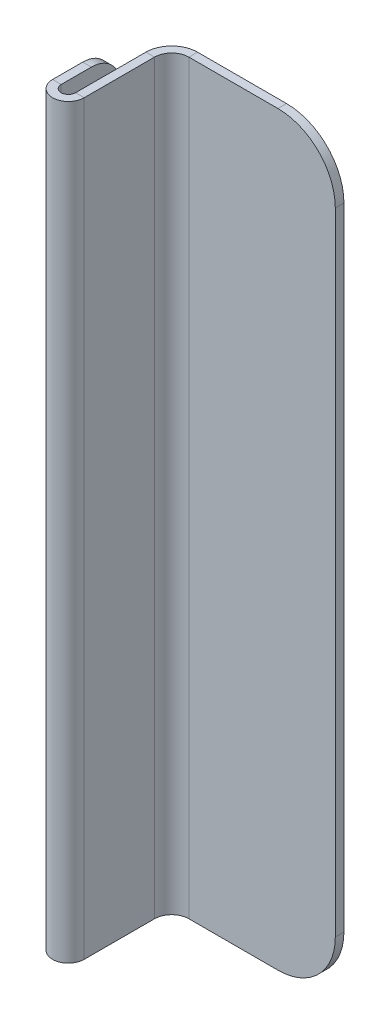
ISO-10303-21;
HEADER;
FILE_DESCRIPTION(('STEP AP214'),'2;1');
FILE_NAME('part.step','',(''),(''),'','','');
FILE_SCHEMA(('AUTOMOTIVE_DESIGN { 1 0 10303 214 1 1 1 1 }'));
ENDSEC;
DATA;
#1=APPLICATION_CONTEXT('core data for automotive mechanical design processes');
#2=APPLICATION_PROTOCOL_DEFINITION('international standard','automotive_design',2000,#1);
#3=PRODUCT_CONTEXT('',#1,'mechanical');
#4=PRODUCT('Part','Part','',(#3));
#5=PRODUCT_RELATED_PRODUCT_CATEGORY('part','',(#4));
#6=PRODUCT_DEFINITION_FORMATION('','',#4);
#7=PRODUCT_DEFINITION_CONTEXT('part definition',#1,'design');
#8=PRODUCT_DEFINITION('design','',#6,#7);
#9=PRODUCT_DEFINITION_SHAPE('','',#8);
#10=(LENGTH_UNIT() NAMED_UNIT(*) SI_UNIT(.MILLI.,.METRE.));
#11=(NAMED_UNIT(*) PLANE_ANGLE_UNIT() SI_UNIT($,.RADIAN.));
#12=(NAMED_UNIT(*) SI_UNIT($,.STERADIAN.) SOLID_ANGLE_UNIT());
#13=UNCERTAINTY_MEASURE_WITH_UNIT(LENGTH_MEASURE(1.E-05),#10,'distance_accuracy_value','');
#14=(GEOMETRIC_REPRESENTATION_CONTEXT(3) GLOBAL_UNCERTAINTY_ASSIGNED_CONTEXT((#13)) GLOBAL_UNIT_ASSIGNED_CONTEXT((#10,
#11,#12)) REPRESENTATION_CONTEXT('',''));
#15=CARTESIAN_POINT('',(0.,0.,0.));
#16=DIRECTION('',(0.,0.,1.));
#17=DIRECTION('',(1.,0.,0.));
#18=AXIS2_PLACEMENT_3D('',#15,#16,#17);
#19=CARTESIAN_POINT('',(-47.7819300058113,-53.0514705882353,-1.5));
#20=DIRECTION('',(0.,-1.,0.));
#21=DIRECTION('',(0.,0.,-1.));
#22=AXIS2_PLACEMENT_3D('',#19,#20,#21);
#23=PLANE('',#22);
#24=DIRECTION('',(1.,0.,0.));
#25=VECTOR('',#24,1.);
#26=CARTESIAN_POINT('',(-47.7819300058113,-53.0514705882353,0.));
#27=LINE('',#26,#25);
#28=CARTESIAN_POINT('',(-43.2819300058113,-53.0514705882353,0.));
#29=VERTEX_POINT('',#28);
#30=CARTESIAN_POINT('',(-27.7819300058113,-53.0514705882353,0.));
#31=VERTEX_POINT('',#30);
#32=EDGE_CURVE('E263',#29,#31,#27,.T.);
#33=ORIENTED_EDGE('',*,*,#32,.F.);
#34=DIRECTION('',(0.,0.,-1.));
#35=VECTOR('',#34,1.);
#36=CARTESIAN_POINT('',(-43.2819300058113,-53.0514705882353,0.));
#37=LINE('',#36,#35);
#38=CARTESIAN_POINT('',(-43.2819300058113,-53.0514705882353,-1.5));
#39=VERTEX_POINT('',#38);
#40=EDGE_CURVE('E247',#29,#39,#37,.T.);
#41=ORIENTED_EDGE('',*,*,#40,.T.);
#42=DIRECTION('',(1.,0.,0.));
#43=VECTOR('',#42,1.);
#44=CARTESIAN_POINT('',(-47.7819300058113,-53.0514705882353,-1.5));
#45=LINE('',#44,#43);
#46=CARTESIAN_POINT('',(-27.7819300058113,-53.0514705882353,-1.5));
#47=VERTEX_POINT('',#46);
#48=EDGE_CURVE('E266',#39,#47,#45,.T.);
#49=ORIENTED_EDGE('',*,*,#48,.T.);
#50=DIRECTION('',(0.,0.,1.));
#51=VECTOR('',#50,1.);
#52=CARTESIAN_POINT('',(-27.7819300058113,-53.0514705882353,-1.5));
#53=LINE('',#52,#51);
#54=EDGE_CURVE('E297',#47,#31,#53,.T.);
#55=ORIENTED_EDGE('',*,*,#54,.T.);
#56=EDGE_LOOP('',(#33,#41,#49,#55));
#57=FACE_BOUND('',#56,.T.);
#58=ADVANCED_FACE('F71',(#57),#23,.T.);
#59=CARTESIAN_POINT('',(0.,0.,-1.5));
#60=DIRECTION('',(0.,0.,1.));
#61=DIRECTION('',(1.,0.,0.));
#62=AXIS2_PLACEMENT_3D('',#59,#60,#61);
#63=PLANE('',#62);
#64=DIRECTION('',(0.,-1.,0.));
#65=VECTOR('',#64,1.);
#66=CARTESIAN_POINT('',(-43.2819300058113,-53.0514705882353,-1.5));
#67=LINE('',#66,#65);
#68=CARTESIAN_POINT('',(-43.2819300058113,76.9485294117647,-1.5));
#69=VERTEX_POINT('',#68);
#70=EDGE_CURVE('E241',#39,#69,#67,.F.);
#71=ORIENTED_EDGE('',*,*,#70,.T.);
#72=DIRECTION('',(-1.,0.,0.));
#73=VECTOR('',#72,1.);
#74=CARTESIAN_POINT('',(-47.7819300058113,76.9485294117647,-1.5));
#75=LINE('',#74,#73);
#76=CARTESIAN_POINT('',(-27.7819300058113,76.9485294117647,-1.5));
#77=VERTEX_POINT('',#76);
#78=EDGE_CURVE('E272',#77,#69,#75,.T.);
#79=ORIENTED_EDGE('',*,*,#78,.F.);
#80=CARTESIAN_POINT('',(-27.7819300058113,66.9485294117647,-1.5));
#81=DIRECTION('',(0.,0.,1.));
#82=DIRECTION('',(1.,0.,0.));
#83=AXIS2_PLACEMENT_3D('',#80,#81,#82);
#84=CIRCLE('',#83,10.);
#85=CARTESIAN_POINT('',(-17.7819300058113,66.9485294117647,-1.5));
#86=VERTEX_POINT('',#85);
#87=EDGE_CURVE('E295',#77,#86,#84,.F.);
#88=ORIENTED_EDGE('',*,*,#87,.T.);
#89=DIRECTION('',(0.,1.,0.));
#90=VECTOR('',#89,1.);
#91=CARTESIAN_POINT('',(-17.7819300058113,76.9485294117647,-1.5));
#92=LINE('',#91,#90);
#93=CARTESIAN_POINT('',(-17.7819300058113,-43.0514705882353,-1.5));
#94=VERTEX_POINT('',#93);
#95=EDGE_CURVE('E268',#94,#86,#92,.T.);
#96=ORIENTED_EDGE('',*,*,#95,.F.);
#97=CARTESIAN_POINT('',(-27.7819300058113,-43.0514705882353,-1.5));
#98=DIRECTION('',(0.,0.,1.));
#99=DIRECTION('',(1.,0.,0.));
#100=AXIS2_PLACEMENT_3D('',#97,#98,#99);
#101=CIRCLE('',#100,10.);
#102=EDGE_CURVE('E292',#94,#47,#101,.F.);
#103=ORIENTED_EDGE('',*,*,#102,.T.);
#104=ORIENTED_EDGE('',*,*,#48,.F.);
#105=EDGE_LOOP('',(#71,#79,#88,#96,#103,#104));
#106=FACE_BOUND('',#105,.T.);
#107=ADVANCED_FACE('F384',(#106),#63,.F.);
#108=CARTESIAN_POINT('',(0.,0.,0.));
#109=DIRECTION('',(0.,0.,1.));
#110=DIRECTION('',(1.,0.,0.));
#111=AXIS2_PLACEMENT_3D('',#108,#109,#110);
#112=PLANE('',#111);
#113=DIRECTION('',(-1.,0.,0.));
#114=VECTOR('',#113,1.);
#115=CARTESIAN_POINT('',(-47.7819300058113,76.9485294117647,0.));
#116=LINE('',#115,#114);
#117=CARTESIAN_POINT('',(-27.7819300058113,76.9485294117647,0.));
#118=VERTEX_POINT('',#117);
#119=CARTESIAN_POINT('',(-43.2819300058113,76.9485294117647,0.));
#120=VERTEX_POINT('',#119);
#121=EDGE_CURVE('E269',#118,#120,#116,.T.);
#122=ORIENTED_EDGE('',*,*,#121,.T.);
#123=DIRECTION('',(0.,-1.,0.));
#124=VECTOR('',#123,1.);
#125=CARTESIAN_POINT('',(-43.2819300058113,-53.0514705882353,0.));
#126=LINE('',#125,#124);
#127=EDGE_CURVE('E253',#29,#120,#126,.F.);
#128=ORIENTED_EDGE('',*,*,#127,.F.);
#129=ORIENTED_EDGE('',*,*,#32,.T.);
#130=CARTESIAN_POINT('',(-27.7819300058113,-43.0514705882353,0.));
#131=DIRECTION('',(0.,0.,1.));
#132=DIRECTION('',(1.,0.,0.));
#133=AXIS2_PLACEMENT_3D('',#130,#131,#132);
#134=CIRCLE('',#133,10.);
#135=CARTESIAN_POINT('',(-17.7819300058113,-43.0514705882353,0.));
#136=VERTEX_POINT('',#135);
#137=EDGE_CURVE('E286',#31,#136,#134,.T.);
#138=ORIENTED_EDGE('',*,*,#137,.T.);
#139=DIRECTION('',(0.,1.,0.));
#140=VECTOR('',#139,1.);
#141=CARTESIAN_POINT('',(-17.7819300058113,76.9485294117647,0.));
#142=LINE('',#141,#140);
#143=CARTESIAN_POINT('',(-17.7819300058113,66.9485294117647,0.));
#144=VERTEX_POINT('',#143);
#145=EDGE_CURVE('E277',#136,#144,#142,.T.);
#146=ORIENTED_EDGE('',*,*,#145,.T.);
#147=CARTESIAN_POINT('',(-27.7819300058113,66.9485294117647,0.));
#148=DIRECTION('',(0.,0.,1.));
#149=DIRECTION('',(1.,0.,0.));
#150=AXIS2_PLACEMENT_3D('',#147,#148,#149);
#151=CIRCLE('',#150,10.);
#152=EDGE_CURVE('E288',#144,#118,#151,.T.);
#153=ORIENTED_EDGE('',*,*,#152,.T.);
#154=EDGE_LOOP('',(#122,#128,#129,#138,#146,#153));
#155=FACE_BOUND('',#154,.T.);
#156=ADVANCED_FACE('F390',(#155),#112,.T.);
#157=CARTESIAN_POINT('',(-47.7819300058113,76.9485294117647,-1.5));
#158=DIRECTION('',(0.,1.,0.));
#159=DIRECTION('',(0.,0.,1.));
#160=AXIS2_PLACEMENT_3D('',#157,#158,#159);
#161=PLANE('',#160);
#162=DIRECTION('',(0.,0.,-1.));
#163=VECTOR('',#162,1.);
#164=CARTESIAN_POINT('',(-43.2819300058113,76.9485294117647,0.));
#165=LINE('',#164,#163);
#166=EDGE_CURVE('E260',#120,#69,#165,.T.);
#167=ORIENTED_EDGE('',*,*,#166,.F.);
#168=ORIENTED_EDGE('',*,*,#121,.F.);
#169=DIRECTION('',(0.,0.,1.));
#170=VECTOR('',#169,1.);
#171=CARTESIAN_POINT('',(-27.7819300058113,76.9485294117647,-1.5));
#172=LINE('',#171,#170);
#173=EDGE_CURVE('E290',#118,#77,#172,.F.);
#174=ORIENTED_EDGE('',*,*,#173,.T.);
#175=ORIENTED_EDGE('',*,*,#78,.T.);
#176=EDGE_LOOP('',(#167,#168,#174,#175));
#177=FACE_BOUND('',#176,.T.);
#178=ADVANCED_FACE('F424',(#177),#161,.T.);
#179=CARTESIAN_POINT('',(-17.7819300058113,76.9485294117647,-1.5));
#180=DIRECTION('',(1.,0.,0.));
#181=DIRECTION('',(0.,1.,0.));
#182=AXIS2_PLACEMENT_3D('',#179,#180,#181);
#183=PLANE('',#182);
#184=ORIENTED_EDGE('',*,*,#95,.T.);
#185=DIRECTION('',(0.,0.,1.));
#186=VECTOR('',#185,1.);
#187=CARTESIAN_POINT('',(-17.7819300058113,66.9485294117647,-1.5));
#188=LINE('',#187,#186);
#189=EDGE_CURVE('E283',#86,#144,#188,.T.);
#190=ORIENTED_EDGE('',*,*,#189,.T.);
#191=ORIENTED_EDGE('',*,*,#145,.F.);
#192=DIRECTION('',(0.,0.,1.));
#193=VECTOR('',#192,1.);
#194=CARTESIAN_POINT('',(-17.7819300058113,-43.0514705882353,-1.5));
#195=LINE('',#194,#193);
#196=EDGE_CURVE('E275',#136,#94,#195,.F.);
#197=ORIENTED_EDGE('',*,*,#196,.T.);
#198=EDGE_LOOP('',(#184,#190,#191,#197));
#199=FACE_BOUND('',#198,.T.);
#200=ADVANCED_FACE('F396',(#199),#183,.T.);
#201=CARTESIAN_POINT('',(-27.7819300058113,66.9485294117647,-1.5));
#202=DIRECTION('',(0.,0.,1.));
#203=DIRECTION('',(1.,0.,0.));
#204=AXIS2_PLACEMENT_3D('',#201,#202,#203);
#205=CYLINDRICAL_SURFACE('',#204,10.);
#206=ORIENTED_EDGE('',*,*,#87,.F.);
#207=ORIENTED_EDGE('',*,*,#173,.F.);
#208=ORIENTED_EDGE('',*,*,#152,.F.);
#209=ORIENTED_EDGE('',*,*,#189,.F.);
#210=EDGE_LOOP('',(#206,#207,#208,#209));
#211=FACE_BOUND('',#210,.T.);
#212=ADVANCED_FACE('F398',(#211),#205,.T.);
#213=CARTESIAN_POINT('',(-27.7819300058113,-43.0514705882353,-1.5));
#214=DIRECTION('',(0.,0.,1.));
#215=DIRECTION('',(1.,0.,0.));
#216=AXIS2_PLACEMENT_3D('',#213,#214,#215);
#217=CYLINDRICAL_SURFACE('',#216,10.);
#218=ORIENTED_EDGE('',*,*,#102,.F.);
#219=ORIENTED_EDGE('',*,*,#196,.F.);
#220=ORIENTED_EDGE('',*,*,#137,.F.);
#221=ORIENTED_EDGE('',*,*,#54,.F.);
#222=EDGE_LOOP('',(#218,#219,#220,#221));
#223=FACE_BOUND('',#222,.T.);
#224=ADVANCED_FACE('F401',(#223),#217,.T.);
#225=CARTESIAN_POINT('',(-43.2819300058113,76.9485294117647,3.));
#226=DIRECTION('',(0.,1.,0.));
#227=DIRECTION('',(0.,0.,1.));
#228=AXIS2_PLACEMENT_3D('',#225,#226,#227);
#229=PLANE('',#228);
#230=DIRECTION('',(1.,0.,0.));
#231=VECTOR('',#230,1.);
#232=CARTESIAN_POINT('',(-47.7819300058113,76.9485294117647,2.99999999999998));
#233=LINE('',#232,#231);
#234=CARTESIAN_POINT('',(-46.2819300058113,76.9485294117647,2.99999999999999));
#235=VERTEX_POINT('',#234);
#236=CARTESIAN_POINT('',(-47.7819300058113,76.9485294117647,2.99999999999998));
#237=VERTEX_POINT('',#236);
#238=EDGE_CURVE('E237',#235,#237,#233,.F.);
#239=ORIENTED_EDGE('',*,*,#238,.F.);
#240=CARTESIAN_POINT('',(-43.2819300058113,76.9485294117647,3.));
#241=DIRECTION('',(0.,-1.,0.));
#242=DIRECTION('',(0.,0.,-1.));
#243=AXIS2_PLACEMENT_3D('',#240,#241,#242);
#244=CIRCLE('',#243,3.00000000000001);
#245=EDGE_CURVE('E250',#120,#235,#244,.F.);
#246=ORIENTED_EDGE('',*,*,#245,.F.);
#247=ORIENTED_EDGE('',*,*,#166,.T.);
#248=CARTESIAN_POINT('',(-43.2819300058113,76.9485294117647,3.));
#249=DIRECTION('',(0.,-1.,0.));
#250=DIRECTION('',(0.,0.,-1.));
#251=AXIS2_PLACEMENT_3D('',#248,#249,#250);
#252=CIRCLE('',#251,4.50000000000001);
#253=EDGE_CURVE('E243',#69,#237,#252,.F.);
#254=ORIENTED_EDGE('',*,*,#253,.T.);
#255=EDGE_LOOP('',(#239,#246,#247,#254));
#256=FACE_BOUND('',#255,.T.);
#257=ADVANCED_FACE('F355',(#256),#229,.T.);
#258=CARTESIAN_POINT('',(-43.2819300058113,-53.0514705882353,3.00000000000001));
#259=DIRECTION('',(0.,1.,0.));
#260=DIRECTION('',(0.,0.,1.));
#261=AXIS2_PLACEMENT_3D('',#258,#259,#260);
#262=PLANE('',#261);
#263=CARTESIAN_POINT('',(-43.2819300058113,-53.0514705882353,3.00000000000001));
#264=DIRECTION('',(0.,-1.,0.));
#265=DIRECTION('',(0.,0.,-1.));
#266=AXIS2_PLACEMENT_3D('',#263,#264,#265);
#267=CIRCLE('',#266,3.00000000000001);
#268=CARTESIAN_POINT('',(-46.2819300058113,-53.0514705882353,3.));
#269=VERTEX_POINT('',#268);
#270=EDGE_CURVE('E256',#269,#29,#267,.T.);
#271=ORIENTED_EDGE('',*,*,#270,.F.);
#272=DIRECTION('',(1.,0.,0.));
#273=VECTOR('',#272,1.);
#274=CARTESIAN_POINT('',(-46.2819300058113,-53.0514705882353,3.));
#275=LINE('',#274,#273);
#276=CARTESIAN_POINT('',(-47.7819300058113,-53.0514705882353,2.99999999999999));
#277=VERTEX_POINT('',#276);
#278=EDGE_CURVE('E225',#269,#277,#275,.F.);
#279=ORIENTED_EDGE('',*,*,#278,.T.);
#280=CARTESIAN_POINT('',(-43.2819300058113,-53.0514705882353,3.00000000000001));
#281=DIRECTION('',(0.,-1.,0.));
#282=DIRECTION('',(0.,0.,-1.));
#283=AXIS2_PLACEMENT_3D('',#280,#281,#282);
#284=CIRCLE('',#283,4.50000000000001);
#285=EDGE_CURVE('E244',#277,#39,#284,.T.);
#286=ORIENTED_EDGE('',*,*,#285,.T.);
#287=ORIENTED_EDGE('',*,*,#40,.F.);
#288=EDGE_LOOP('',(#271,#279,#286,#287));
#289=FACE_BOUND('',#288,.T.);
#290=ADVANCED_FACE('F408',(#289),#262,.F.);
#291=CARTESIAN_POINT('',(-43.2819300058113,-53.0514705882353,3.00000000000001));
#292=DIRECTION('',(0.,-1.,0.));
#293=DIRECTION('',(-1.,0.,0.));
#294=AXIS2_PLACEMENT_3D('',#291,#292,#293);
#295=CYLINDRICAL_SURFACE('',#294,4.50000000000001);
#296=ORIENTED_EDGE('',*,*,#70,.F.);
#297=ORIENTED_EDGE('',*,*,#285,.F.);
#298=DIRECTION('',(0.,-1.,0.));
#299=VECTOR('',#298,1.);
#300=CARTESIAN_POINT('',(-47.7819300058113,76.9485294117647,2.99999999999998));
#301=LINE('',#300,#299);
#302=EDGE_CURVE('E226',#277,#237,#301,.F.);
#303=ORIENTED_EDGE('',*,*,#302,.T.);
#304=ORIENTED_EDGE('',*,*,#253,.F.);
#305=EDGE_LOOP('',(#296,#297,#303,#304));
#306=FACE_BOUND('',#305,.T.);
#307=ADVANCED_FACE('F352',(#306),#295,.T.);
#308=CARTESIAN_POINT('',(-43.2819300058113,-53.0514705882353,3.00000000000001));
#309=DIRECTION('',(0.,-1.,0.));
#310=DIRECTION('',(-1.,0.,0.));
#311=AXIS2_PLACEMENT_3D('',#308,#309,#310);
#312=CYLINDRICAL_SURFACE('',#311,3.00000000000001);
#313=ORIENTED_EDGE('',*,*,#127,.T.);
#314=ORIENTED_EDGE('',*,*,#245,.T.);
#315=DIRECTION('',(0.,-1.,0.));
#316=VECTOR('',#315,1.);
#317=CARTESIAN_POINT('',(-46.2819300058113,76.9485294117647,2.99999999999999));
#318=LINE('',#317,#316);
#319=EDGE_CURVE('E235',#235,#269,#318,.T.);
#320=ORIENTED_EDGE('',*,*,#319,.T.);
#321=ORIENTED_EDGE('',*,*,#270,.T.);
#322=EDGE_LOOP('',(#313,#314,#320,#321));
#323=FACE_BOUND('',#322,.T.);
#324=ADVANCED_FACE('F429',(#323),#312,.F.);
#325=CARTESIAN_POINT('',(-47.7819300058114,-53.0514705882353,18.));
#326=DIRECTION('',(0.,1.,0.));
#327=DIRECTION('',(0.,0.,1.));
#328=AXIS2_PLACEMENT_3D('',#325,#326,#327);
#329=PLANE('',#328);
#330=DIRECTION('',(0.,0.,-1.));
#331=VECTOR('',#330,1.);
#332=CARTESIAN_POINT('',(-46.2819300058114,-53.0514705882353,18.));
#333=LINE('',#332,#331);
#334=CARTESIAN_POINT('',(-46.2819300058114,-53.0514705882353,15.25));
#335=VERTEX_POINT('',#334);
#336=EDGE_CURVE('E217',#269,#335,#333,.F.);
#337=ORIENTED_EDGE('',*,*,#336,.T.);
#338=DIRECTION('',(1.,0.,0.));
#339=VECTOR('',#338,1.);
#340=CARTESIAN_POINT('',(-47.7819300058114,-53.0514705882353,15.25));
#341=LINE('',#340,#339);
#342=CARTESIAN_POINT('',(-47.7819300058114,-53.0514705882353,15.25));
#343=VERTEX_POINT('',#342);
#344=EDGE_CURVE('E188',#343,#335,#341,.T.);
#345=ORIENTED_EDGE('',*,*,#344,.F.);
#346=DIRECTION('',(0.,0.,1.));
#347=VECTOR('',#346,1.);
#348=CARTESIAN_POINT('',(-47.7819300058113,-53.0514705882353,-1.50563064211053E-13));
#349=LINE('',#348,#347);
#350=EDGE_CURVE('E228',#277,#343,#349,.T.);
#351=ORIENTED_EDGE('',*,*,#350,.F.);
#352=ORIENTED_EDGE('',*,*,#278,.F.);
#353=EDGE_LOOP('',(#337,#345,#351,#352));
#354=FACE_BOUND('',#353,.T.);
#355=ADVANCED_FACE('F223',(#354),#329,.F.);
#356=CARTESIAN_POINT('',(-47.7819300058113,76.9485294117647,0.));
#357=DIRECTION('',(0.,-1.,0.));
#358=DIRECTION('',(0.,0.,-1.));
#359=AXIS2_PLACEMENT_3D('',#356,#357,#358);
#360=PLANE('',#359);
#361=DIRECTION('',(0.,0.,-1.));
#362=VECTOR('',#361,1.);
#363=CARTESIAN_POINT('',(-47.7819300058113,76.9485294117647,-2.30340502497601E-13));
#364=LINE('',#363,#362);
#365=CARTESIAN_POINT('',(-47.7819300058114,76.9485294117647,15.25));
#366=VERTEX_POINT('',#365);
#367=EDGE_CURVE('E259',#366,#237,#364,.T.);
#368=ORIENTED_EDGE('',*,*,#367,.F.);
#369=DIRECTION('',(1.,0.,0.));
#370=VECTOR('',#369,1.);
#371=CARTESIAN_POINT('',(-47.7819300058114,76.9485294117647,15.25));
#372=LINE('',#371,#370);
#373=CARTESIAN_POINT('',(-46.2819300058114,76.9485294117647,15.25));
#374=VERTEX_POINT('',#373);
#375=EDGE_CURVE('E200',#366,#374,#372,.T.);
#376=ORIENTED_EDGE('',*,*,#375,.T.);
#377=DIRECTION('',(0.,0.,1.));
#378=VECTOR('',#377,1.);
#379=CARTESIAN_POINT('',(-46.2819300058113,76.9485294117647,0.));
#380=LINE('',#379,#378);
#381=EDGE_CURVE('E218',#374,#235,#380,.F.);
#382=ORIENTED_EDGE('',*,*,#381,.T.);
#383=ORIENTED_EDGE('',*,*,#238,.T.);
#384=EDGE_LOOP('',(#368,#376,#382,#383));
#385=FACE_BOUND('',#384,.T.);
#386=ADVANCED_FACE('F358',(#385),#360,.F.);
#387=CARTESIAN_POINT('',(-47.7819300058113,0.,-1.71014093425388E-13));
#388=DIRECTION('',(1.,0.,0.));
#389=DIRECTION('',(0.,0.,-1.));
#390=AXIS2_PLACEMENT_3D('',#387,#388,#389);
#391=PLANE('',#390);
#392=ORIENTED_EDGE('',*,*,#350,.T.);
#393=DIRECTION('',(0.,1.,0.));
#394=VECTOR('',#393,1.);
#395=CARTESIAN_POINT('',(-47.7819300058114,76.9485294117647,15.25));
#396=LINE('',#395,#394);
#397=EDGE_CURVE('E347',#366,#343,#396,.F.);
#398=ORIENTED_EDGE('',*,*,#397,.F.);
#399=ORIENTED_EDGE('',*,*,#367,.T.);
#400=ORIENTED_EDGE('',*,*,#302,.F.);
#401=EDGE_LOOP('',(#392,#398,#399,#400));
#402=FACE_BOUND('',#401,.T.);
#403=ADVANCED_FACE('F346',(#402),#391,.F.);
#404=CARTESIAN_POINT('',(-46.2819300058113,0.,-1.65776871417123E-13));
#405=DIRECTION('',(1.,0.,0.));
#406=DIRECTION('',(0.,0.,-1.));
#407=AXIS2_PLACEMENT_3D('',#404,#405,#406);
#408=PLANE('',#407);
#409=DIRECTION('',(0.,1.,0.));
#410=VECTOR('',#409,1.);
#411=CARTESIAN_POINT('',(-46.2819300058114,76.9485294117647,15.25));
#412=LINE('',#411,#410);
#413=EDGE_CURVE('E207',#374,#335,#412,.F.);
#414=ORIENTED_EDGE('',*,*,#413,.T.);
#415=ORIENTED_EDGE('',*,*,#336,.F.);
#416=ORIENTED_EDGE('',*,*,#319,.F.);
#417=ORIENTED_EDGE('',*,*,#381,.F.);
#418=EDGE_LOOP('',(#414,#415,#416,#417));
#419=FACE_BOUND('',#418,.T.);
#420=ADVANCED_FACE('F215',(#419),#408,.T.);
#421=CARTESIAN_POINT('',(-51.7819300058114,76.9485294117647,10.125));
#422=DIRECTION('',(0.,-1.,0.));
#423=DIRECTION('',(0.,0.,1.));
#424=AXIS2_PLACEMENT_3D('',#421,#422,#423);
#425=PLANE('',#424);
#426=DIRECTION('',(0.,0.,1.));
#427=VECTOR('',#426,1.);
#428=CARTESIAN_POINT('',(-50.2819300058114,76.9485294117647,10.125));
#429=LINE('',#428,#427);
#430=CARTESIAN_POINT('',(-50.2819300058114,76.9485294117647,9.99999999999998));
#431=VERTEX_POINT('',#430);
#432=CARTESIAN_POINT('',(-50.2819300058114,76.9485294117647,15.25));
#433=VERTEX_POINT('',#432);
#434=EDGE_CURVE('E322',#431,#433,#429,.T.);
#435=ORIENTED_EDGE('',*,*,#434,.F.);
#436=DIRECTION('',(1.,0.,0.));
#437=VECTOR('',#436,1.);
#438=CARTESIAN_POINT('',(-51.7819300058114,76.9485294117647,9.99999999999998));
#439=LINE('',#438,#437);
#440=CARTESIAN_POINT('',(-51.7819300058114,76.9485294117647,9.99999999999998));
#441=VERTEX_POINT('',#440);
#442=EDGE_CURVE('E15',#431,#441,#439,.F.);
#443=ORIENTED_EDGE('',*,*,#442,.T.);
#444=DIRECTION('',(0.,0.,1.));
#445=VECTOR('',#444,1.);
#446=CARTESIAN_POINT('',(-51.7819300058114,76.9485294117647,10.125));
#447=LINE('',#446,#445);
#448=CARTESIAN_POINT('',(-51.7819300058114,76.9485294117647,15.25));
#449=VERTEX_POINT('',#448);
#450=EDGE_CURVE('E331',#441,#449,#447,.T.);
#451=ORIENTED_EDGE('',*,*,#450,.T.);
#452=DIRECTION('',(-1.,0.,0.));
#453=VECTOR('',#452,1.);
#454=CARTESIAN_POINT('',(-51.7819300058114,76.9485294117647,15.25));
#455=LINE('',#454,#453);
#456=EDGE_CURVE('E339',#433,#449,#455,.T.);
#457=ORIENTED_EDGE('',*,*,#456,.F.);
#458=EDGE_LOOP('',(#435,#443,#451,#457));
#459=FACE_BOUND('',#458,.T.);
#460=ADVANCED_FACE('F368',(#459),#425,.F.);
#461=CARTESIAN_POINT('',(-51.7819300058113,11.9485294117647,4.99999999999998));
#462=DIRECTION('',(0.,0.,1.));
#463=DIRECTION('',(0.,1.,0.));
#464=AXIS2_PLACEMENT_3D('',#461,#462,#463);
#465=PLANE('',#464);
#466=DIRECTION('',(0.,1.,0.));
#467=VECTOR('',#466,1.);
#468=CARTESIAN_POINT('',(-50.2819300058113,11.9485294117647,4.99999999999998));
#469=LINE('',#468,#467);
#470=CARTESIAN_POINT('',(-50.2819300058113,-48.0514705882353,4.99999999999998));
#471=VERTEX_POINT('',#470);
#472=CARTESIAN_POINT('',(-50.2819300058113,71.9485294117647,4.99999999999998));
#473=VERTEX_POINT('',#472);
#474=EDGE_CURVE('E313',#471,#473,#469,.T.);
#475=ORIENTED_EDGE('',*,*,#474,.F.);
#476=DIRECTION('',(1.,0.,0.));
#477=VECTOR('',#476,1.);
#478=CARTESIAN_POINT('',(-51.7819300058113,-48.0514705882353,4.99999999999998));
#479=LINE('',#478,#477);
#480=CARTESIAN_POINT('',(-51.7819300058113,-48.0514705882353,4.99999999999998));
#481=VERTEX_POINT('',#480);
#482=EDGE_CURVE('E302',#471,#481,#479,.F.);
#483=ORIENTED_EDGE('',*,*,#482,.T.);
#484=DIRECTION('',(0.,1.,0.));
#485=VECTOR('',#484,1.);
#486=CARTESIAN_POINT('',(-51.7819300058113,11.9485294117647,4.99999999999998));
#487=LINE('',#486,#485);
#488=CARTESIAN_POINT('',(-51.7819300058113,71.9485294117647,4.99999999999998));
#489=VERTEX_POINT('',#488);
#490=EDGE_CURVE('E328',#481,#489,#487,.T.);
#491=ORIENTED_EDGE('',*,*,#490,.T.);
#492=DIRECTION('',(1.,0.,0.));
#493=VECTOR('',#492,1.);
#494=CARTESIAN_POINT('',(-51.7819300058113,71.9485294117647,4.99999999999998));
#495=LINE('',#494,#493);
#496=EDGE_CURVE('E300',#489,#473,#495,.T.);
#497=ORIENTED_EDGE('',*,*,#496,.T.);
#498=EDGE_LOOP('',(#475,#483,#491,#497));
#499=FACE_BOUND('',#498,.T.);
#500=ADVANCED_FACE('F317',(#499),#465,.F.);
#501=CARTESIAN_POINT('',(-51.7819300058114,-53.0514705882353,10.125));
#502=DIRECTION('',(0.,1.,0.));
#503=DIRECTION('',(0.,0.,-1.));
#504=AXIS2_PLACEMENT_3D('',#501,#502,#503);
#505=PLANE('',#504);
#506=DIRECTION('',(0.,0.,-1.));
#507=VECTOR('',#506,1.);
#508=CARTESIAN_POINT('',(-51.7819300058114,-53.0514705882353,10.125));
#509=LINE('',#508,#507);
#510=CARTESIAN_POINT('',(-51.7819300058114,-53.0514705882353,15.25));
#511=VERTEX_POINT('',#510);
#512=CARTESIAN_POINT('',(-51.7819300058114,-53.0514705882353,9.99999999999998));
#513=VERTEX_POINT('',#512);
#514=EDGE_CURVE('E321',#511,#513,#509,.T.);
#515=ORIENTED_EDGE('',*,*,#514,.T.);
#516=DIRECTION('',(1.,0.,0.));
#517=VECTOR('',#516,1.);
#518=CARTESIAN_POINT('',(-51.7819300058114,-53.0514705882353,9.99999999999998));
#519=LINE('',#518,#517);
#520=CARTESIAN_POINT('',(-50.2819300058114,-53.0514705882353,9.99999999999998));
#521=VERTEX_POINT('',#520);
#522=EDGE_CURVE('E94',#513,#521,#519,.T.);
#523=ORIENTED_EDGE('',*,*,#522,.T.);
#524=DIRECTION('',(0.,0.,1.));
#525=VECTOR('',#524,1.);
#526=CARTESIAN_POINT('',(-50.2819300058114,-53.0514705882353,10.125));
#527=LINE('',#526,#525);
#528=CARTESIAN_POINT('',(-50.2819300058114,-53.0514705882353,15.25));
#529=VERTEX_POINT('',#528);
#530=EDGE_CURVE('E199',#529,#521,#527,.F.);
#531=ORIENTED_EDGE('',*,*,#530,.F.);
#532=DIRECTION('',(-1.,0.,0.));
#533=VECTOR('',#532,1.);
#534=CARTESIAN_POINT('',(-51.7819300058114,-53.0514705882353,15.25));
#535=LINE('',#534,#533);
#536=EDGE_CURVE('E240',#529,#511,#535,.T.);
#537=ORIENTED_EDGE('',*,*,#536,.T.);
#538=EDGE_LOOP('',(#515,#523,#531,#537));
#539=FACE_BOUND('',#538,.T.);
#540=ADVANCED_FACE('F329',(#539),#505,.F.);
#541=CARTESIAN_POINT('',(-51.7819300058114,11.9485294117647,10.125));
#542=DIRECTION('',(-1.,0.,0.));
#543=DIRECTION('',(0.,0.,1.));
#544=AXIS2_PLACEMENT_3D('',#541,#542,#543);
#545=PLANE('',#544);
#546=ORIENTED_EDGE('',*,*,#490,.F.);
#547=CARTESIAN_POINT('',(-51.7819300058114,-48.0514705882353,9.99999999999998));
#548=DIRECTION('',(-1.,0.,0.));
#549=DIRECTION('',(0.,0.,1.));
#550=AXIS2_PLACEMENT_3D('',#547,#548,#549);
#551=CIRCLE('',#550,5.);
#552=EDGE_CURVE('E307',#481,#513,#551,.T.);
#553=ORIENTED_EDGE('',*,*,#552,.T.);
#554=ORIENTED_EDGE('',*,*,#514,.F.);
#555=DIRECTION('',(0.,-1.,0.));
#556=VECTOR('',#555,1.);
#557=CARTESIAN_POINT('',(-51.7819300058114,11.9485294117647,15.25));
#558=LINE('',#557,#556);
#559=EDGE_CURVE('E210',#449,#511,#558,.T.);
#560=ORIENTED_EDGE('',*,*,#559,.F.);
#561=ORIENTED_EDGE('',*,*,#450,.F.);
#562=CARTESIAN_POINT('',(-51.7819300058114,71.9485294117647,9.99999999999998));
#563=DIRECTION('',(-1.,0.,0.));
#564=DIRECTION('',(0.,0.,1.));
#565=AXIS2_PLACEMENT_3D('',#562,#563,#564);
#566=CIRCLE('',#565,5.);
#567=EDGE_CURVE('E305',#441,#489,#566,.T.);
#568=ORIENTED_EDGE('',*,*,#567,.T.);
#569=EDGE_LOOP('',(#546,#553,#554,#560,#561,#568));
#570=FACE_BOUND('',#569,.T.);
#571=ADVANCED_FACE('F326',(#570),#545,.T.);
#572=CARTESIAN_POINT('',(-50.2819300058114,11.9485294117647,10.125));
#573=DIRECTION('',(-1.,0.,0.));
#574=DIRECTION('',(0.,0.,1.));
#575=AXIS2_PLACEMENT_3D('',#572,#573,#574);
#576=PLANE('',#575);
#577=ORIENTED_EDGE('',*,*,#530,.T.);
#578=CARTESIAN_POINT('',(-50.2819300058114,-48.0514705882353,9.99999999999998));
#579=DIRECTION('',(-1.,0.,0.));
#580=DIRECTION('',(0.,0.,1.));
#581=AXIS2_PLACEMENT_3D('',#578,#579,#580);
#582=CIRCLE('',#581,5.);
#583=EDGE_CURVE('E79',#521,#471,#582,.F.);
#584=ORIENTED_EDGE('',*,*,#583,.T.);
#585=ORIENTED_EDGE('',*,*,#474,.T.);
#586=CARTESIAN_POINT('',(-50.2819300058114,71.9485294117647,9.99999999999998));
#587=DIRECTION('',(-1.,0.,0.));
#588=DIRECTION('',(0.,0.,1.));
#589=AXIS2_PLACEMENT_3D('',#586,#587,#588);
#590=CIRCLE('',#589,5.);
#591=EDGE_CURVE('E86',#473,#431,#590,.F.);
#592=ORIENTED_EDGE('',*,*,#591,.T.);
#593=ORIENTED_EDGE('',*,*,#434,.T.);
#594=DIRECTION('',(0.,1.,0.));
#595=VECTOR('',#594,1.);
#596=CARTESIAN_POINT('',(-50.2819300058114,11.9485294117647,15.25));
#597=LINE('',#596,#595);
#598=EDGE_CURVE('E336',#433,#529,#597,.F.);
#599=ORIENTED_EDGE('',*,*,#598,.T.);
#600=EDGE_LOOP('',(#577,#584,#585,#592,#593,#599));
#601=FACE_BOUND('',#600,.T.);
#602=ADVANCED_FACE('F312',(#601),#576,.F.);
#603=CARTESIAN_POINT('',(-49.0319300058114,-53.0514705882353,15.25));
#604=DIRECTION('',(0.,-1.,0.));
#605=DIRECTION('',(1.,0.,0.));
#606=AXIS2_PLACEMENT_3D('',#603,#604,#605);
#607=PLANE('',#606);
#608=ORIENTED_EDGE('',*,*,#536,.F.);
#609=CARTESIAN_POINT('',(-49.0319300058114,-53.0514705882353,15.25));
#610=DIRECTION('',(0.,1.,0.));
#611=DIRECTION('',(-1.,0.,0.));
#612=AXIS2_PLACEMENT_3D('',#609,#610,#611);
#613=CIRCLE('',#612,1.25);
#614=EDGE_CURVE('E194',#343,#529,#613,.F.);
#615=ORIENTED_EDGE('',*,*,#614,.F.);
#616=ORIENTED_EDGE('',*,*,#344,.T.);
#617=CARTESIAN_POINT('',(-49.0319300058114,-53.0514705882353,15.25));
#618=DIRECTION('',(0.,1.,0.));
#619=DIRECTION('',(-1.,0.,0.));
#620=AXIS2_PLACEMENT_3D('',#617,#618,#619);
#621=CIRCLE('',#620,2.75);
#622=EDGE_CURVE('E192',#335,#511,#621,.F.);
#623=ORIENTED_EDGE('',*,*,#622,.T.);
#624=EDGE_LOOP('',(#608,#615,#616,#623));
#625=FACE_BOUND('',#624,.T.);
#626=ADVANCED_FACE('F191',(#625),#607,.T.);
#627=CARTESIAN_POINT('',(-49.0319300058114,76.9485294117647,15.25));
#628=DIRECTION('',(0.,-1.,0.));
#629=DIRECTION('',(1.,0.,0.));
#630=AXIS2_PLACEMENT_3D('',#627,#628,#629);
#631=PLANE('',#630);
#632=CARTESIAN_POINT('',(-49.0319300058114,76.9485294117647,15.25));
#633=DIRECTION('',(0.,1.,0.));
#634=DIRECTION('',(-1.,0.,0.));
#635=AXIS2_PLACEMENT_3D('',#632,#633,#634);
#636=CIRCLE('',#635,1.25);
#637=EDGE_CURVE('E372',#433,#366,#636,.T.);
#638=ORIENTED_EDGE('',*,*,#637,.F.);
#639=ORIENTED_EDGE('',*,*,#456,.T.);
#640=CARTESIAN_POINT('',(-49.0319300058114,76.9485294117647,15.25));
#641=DIRECTION('',(0.,1.,0.));
#642=DIRECTION('',(-1.,0.,0.));
#643=AXIS2_PLACEMENT_3D('',#640,#641,#642);
#644=CIRCLE('',#643,2.75);
#645=EDGE_CURVE('E220',#449,#374,#644,.T.);
#646=ORIENTED_EDGE('',*,*,#645,.T.);
#647=ORIENTED_EDGE('',*,*,#375,.F.);
#648=EDGE_LOOP('',(#638,#639,#646,#647));
#649=FACE_BOUND('',#648,.T.);
#650=ADVANCED_FACE('F371',(#649),#631,.F.);
#651=CARTESIAN_POINT('',(-49.0319300058114,76.9485294117647,15.25));
#652=DIRECTION('',(0.,1.,0.));
#653=DIRECTION('',(-1.,0.,0.));
#654=AXIS2_PLACEMENT_3D('',#651,#652,#653);
#655=CYLINDRICAL_SURFACE('',#654,2.75);
#656=ORIENTED_EDGE('',*,*,#413,.F.);
#657=ORIENTED_EDGE('',*,*,#645,.F.);
#658=ORIENTED_EDGE('',*,*,#559,.T.);
#659=ORIENTED_EDGE('',*,*,#622,.F.);
#660=EDGE_LOOP('',(#656,#657,#658,#659));
#661=FACE_BOUND('',#660,.T.);
#662=ADVANCED_FACE('F205',(#661),#655,.T.);
#663=CARTESIAN_POINT('',(-49.0319300058114,76.9485294117647,15.25));
#664=DIRECTION('',(0.,1.,0.));
#665=DIRECTION('',(-1.,0.,0.));
#666=AXIS2_PLACEMENT_3D('',#663,#664,#665);
#667=CYLINDRICAL_SURFACE('',#666,1.25);
#668=ORIENTED_EDGE('',*,*,#397,.T.);
#669=ORIENTED_EDGE('',*,*,#614,.T.);
#670=ORIENTED_EDGE('',*,*,#598,.F.);
#671=ORIENTED_EDGE('',*,*,#637,.T.);
#672=EDGE_LOOP('',(#668,#669,#670,#671));
#673=FACE_BOUND('',#672,.T.);
#674=ADVANCED_FACE('F377',(#673),#667,.F.);
#675=CARTESIAN_POINT('',(-51.7819300058113,-48.0514705882353,9.99999999999998));
#676=DIRECTION('',(-1.,0.,0.));
#677=DIRECTION('',(0.,0.,1.));
#678=AXIS2_PLACEMENT_3D('',#675,#676,#677);
#679=CYLINDRICAL_SURFACE('',#678,5.);
#680=ORIENTED_EDGE('',*,*,#583,.F.);
#681=ORIENTED_EDGE('',*,*,#522,.F.);
#682=ORIENTED_EDGE('',*,*,#552,.F.);
#683=ORIENTED_EDGE('',*,*,#482,.F.);
#684=EDGE_LOOP('',(#680,#681,#682,#683));
#685=FACE_BOUND('',#684,.T.);
#686=ADVANCED_FACE('F324',(#685),#679,.T.);
#687=CARTESIAN_POINT('',(-51.7819300058114,71.9485294117647,9.99999999999998));
#688=DIRECTION('',(-1.,0.,0.));
#689=DIRECTION('',(0.,0.,1.));
#690=AXIS2_PLACEMENT_3D('',#687,#688,#689);
#691=CYLINDRICAL_SURFACE('',#690,5.);
#692=ORIENTED_EDGE('',*,*,#591,.F.);
#693=ORIENTED_EDGE('',*,*,#496,.F.);
#694=ORIENTED_EDGE('',*,*,#567,.F.);
#695=ORIENTED_EDGE('',*,*,#442,.F.);
#696=EDGE_LOOP('',(#692,#693,#694,#695));
#697=FACE_BOUND('',#696,.T.);
#698=ADVANCED_FACE('F73',(#697),#691,.T.);
#699=CLOSED_SHELL('',(#58,#107,#156,#178,#200,#212,#224,#257,#290,#307,#324,#355,#386,#403,#420,
#460,#500,#540,#571,#602,#626,#650,#662,#674,#686,#698));
#700=MANIFOLD_SOLID_BREP('B2',#699);
#701=ADVANCED_BREP_SHAPE_REPRESENTATION('',(#18,#700),#14);
#702=SHAPE_DEFINITION_REPRESENTATION(#9,#701);
ENDSEC;
END-ISO-10303-21;
